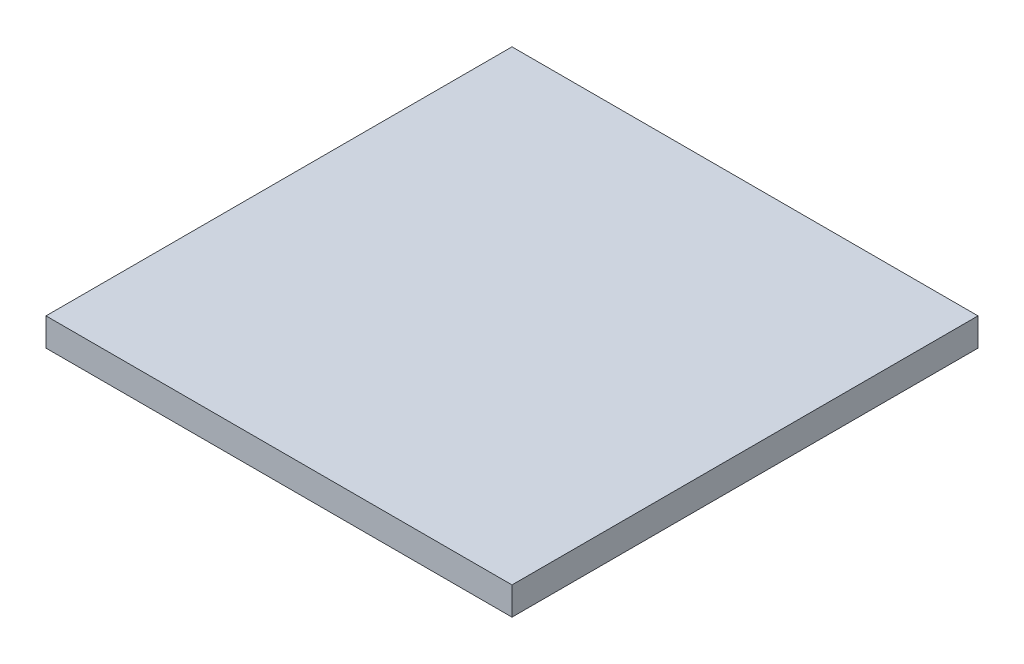
ISO-10303-21;
HEADER;
FILE_DESCRIPTION(('STEP AP214'),'2;1');
FILE_NAME('part.step','',(''),(''),'','','');
FILE_SCHEMA(('AUTOMOTIVE_DESIGN { 1 0 10303 214 1 1 1 1 }'));
ENDSEC;
DATA;
#1=APPLICATION_CONTEXT('core data for automotive mechanical design processes');
#2=APPLICATION_PROTOCOL_DEFINITION('international standard','automotive_design',2000,#1);
#3=PRODUCT_CONTEXT('',#1,'mechanical');
#4=PRODUCT('Part','Part','',(#3));
#5=PRODUCT_RELATED_PRODUCT_CATEGORY('part','',(#4));
#6=PRODUCT_DEFINITION_FORMATION('','',#4);
#7=PRODUCT_DEFINITION_CONTEXT('part definition',#1,'design');
#8=PRODUCT_DEFINITION('design','',#6,#7);
#9=PRODUCT_DEFINITION_SHAPE('','',#8);
#10=(LENGTH_UNIT() NAMED_UNIT(*) SI_UNIT(.MILLI.,.METRE.));
#11=(NAMED_UNIT(*) PLANE_ANGLE_UNIT() SI_UNIT($,.RADIAN.));
#12=(NAMED_UNIT(*) SI_UNIT($,.STERADIAN.) SOLID_ANGLE_UNIT());
#13=UNCERTAINTY_MEASURE_WITH_UNIT(LENGTH_MEASURE(1.E-05),#10,'distance_accuracy_value','');
#14=(GEOMETRIC_REPRESENTATION_CONTEXT(3) GLOBAL_UNCERTAINTY_ASSIGNED_CONTEXT((#13)) GLOBAL_UNIT_ASSIGNED_CONTEXT((#10,
#11,#12)) REPRESENTATION_CONTEXT('',''));
#15=CARTESIAN_POINT('',(0.,0.,0.));
#16=DIRECTION('',(0.,0.,1.));
#17=DIRECTION('',(1.,0.,0.));
#18=AXIS2_PLACEMENT_3D('',#15,#16,#17);
#19=CARTESIAN_POINT('',(0.,3.,0.));
#20=DIRECTION('',(-1.,0.,0.));
#21=DIRECTION('',(0.,0.,1.));
#22=AXIS2_PLACEMENT_3D('',#19,#20,#21);
#23=PLANE('',#22);
#24=DIRECTION('',(0.,0.,-1.));
#25=VECTOR('',#24,1.);
#26=CARTESIAN_POINT('',(0.,0.,0.));
#27=LINE('',#26,#25);
#28=CARTESIAN_POINT('',(0.,0.,0.));
#29=VERTEX_POINT('',#28);
#30=CARTESIAN_POINT('',(0.,0.,-50.));
#31=VERTEX_POINT('',#30);
#32=EDGE_CURVE('E107',#29,#31,#27,.T.);
#33=ORIENTED_EDGE('',*,*,#32,.T.);
#34=DIRECTION('',(0.,-1.,0.));
#35=VECTOR('',#34,1.);
#36=CARTESIAN_POINT('',(0.,3.,-50.));
#37=LINE('',#36,#35);
#38=CARTESIAN_POINT('',(0.,3.,-50.));
#39=VERTEX_POINT('',#38);
#40=EDGE_CURVE('E11',#39,#31,#37,.T.);
#41=ORIENTED_EDGE('',*,*,#40,.F.);
#42=DIRECTION('',(0.,0.,-1.));
#43=VECTOR('',#42,1.);
#44=CARTESIAN_POINT('',(0.,3.,0.));
#45=LINE('',#44,#43);
#46=CARTESIAN_POINT('',(0.,3.,0.));
#47=VERTEX_POINT('',#46);
#48=EDGE_CURVE('E91',#47,#39,#45,.T.);
#49=ORIENTED_EDGE('',*,*,#48,.F.);
#50=DIRECTION('',(0.,-1.,0.));
#51=VECTOR('',#50,1.);
#52=CARTESIAN_POINT('',(0.,3.,0.));
#53=LINE('',#52,#51);
#54=EDGE_CURVE('E103',#47,#29,#53,.T.);
#55=ORIENTED_EDGE('',*,*,#54,.T.);
#56=EDGE_LOOP('',(#33,#41,#49,#55));
#57=FACE_BOUND('',#56,.T.);
#58=ADVANCED_FACE('F39',(#57),#23,.F.);
#59=CARTESIAN_POINT('',(0.,3.,-50.));
#60=DIRECTION('',(0.,0.,1.));
#61=DIRECTION('',(1.,0.,0.));
#62=AXIS2_PLACEMENT_3D('',#59,#60,#61);
#63=PLANE('',#62);
#64=DIRECTION('',(-1.,0.,0.));
#65=VECTOR('',#64,1.);
#66=CARTESIAN_POINT('',(0.,0.,-50.));
#67=LINE('',#66,#65);
#68=CARTESIAN_POINT('',(-50.,0.,-50.));
#69=VERTEX_POINT('',#68);
#70=EDGE_CURVE('E96',#31,#69,#67,.T.);
#71=ORIENTED_EDGE('',*,*,#70,.T.);
#72=DIRECTION('',(0.,-1.,0.));
#73=VECTOR('',#72,1.);
#74=CARTESIAN_POINT('',(-50.,3.,-50.));
#75=LINE('',#74,#73);
#76=CARTESIAN_POINT('',(-50.,3.,-50.));
#77=VERTEX_POINT('',#76);
#78=EDGE_CURVE('E48',#77,#69,#75,.T.);
#79=ORIENTED_EDGE('',*,*,#78,.F.);
#80=DIRECTION('',(-1.,0.,0.));
#81=VECTOR('',#80,1.);
#82=CARTESIAN_POINT('',(0.,3.,-50.));
#83=LINE('',#82,#81);
#84=EDGE_CURVE('E86',#39,#77,#83,.T.);
#85=ORIENTED_EDGE('',*,*,#84,.F.);
#86=ORIENTED_EDGE('',*,*,#40,.T.);
#87=EDGE_LOOP('',(#71,#79,#85,#86));
#88=FACE_BOUND('',#87,.T.);
#89=ADVANCED_FACE('F95',(#88),#63,.F.);
#90=CARTESIAN_POINT('',(-50.,3.,0.));
#91=DIRECTION('',(1.,0.,0.));
#92=DIRECTION('',(0.,0.,-1.));
#93=AXIS2_PLACEMENT_3D('',#90,#91,#92);
#94=PLANE('',#93);
#95=DIRECTION('',(0.,0.,1.));
#96=VECTOR('',#95,1.);
#97=CARTESIAN_POINT('',(-50.,0.,0.));
#98=LINE('',#97,#96);
#99=CARTESIAN_POINT('',(-50.,0.,0.));
#100=VERTEX_POINT('',#99);
#101=EDGE_CURVE('E73',#69,#100,#98,.T.);
#102=ORIENTED_EDGE('',*,*,#101,.T.);
#103=DIRECTION('',(0.,-1.,0.));
#104=VECTOR('',#103,1.);
#105=CARTESIAN_POINT('',(-50.,3.,0.));
#106=LINE('',#105,#104);
#107=CARTESIAN_POINT('',(-50.,3.,0.));
#108=VERTEX_POINT('',#107);
#109=EDGE_CURVE('E98',#108,#100,#106,.T.);
#110=ORIENTED_EDGE('',*,*,#109,.F.);
#111=DIRECTION('',(0.,0.,1.));
#112=VECTOR('',#111,1.);
#113=CARTESIAN_POINT('',(-50.,3.,0.));
#114=LINE('',#113,#112);
#115=EDGE_CURVE('E89',#77,#108,#114,.T.);
#116=ORIENTED_EDGE('',*,*,#115,.F.);
#117=ORIENTED_EDGE('',*,*,#78,.T.);
#118=EDGE_LOOP('',(#102,#110,#116,#117));
#119=FACE_BOUND('',#118,.T.);
#120=ADVANCED_FACE('F99',(#119),#94,.F.);
#121=CARTESIAN_POINT('',(0.,3.,0.));
#122=DIRECTION('',(0.,0.,-1.));
#123=DIRECTION('',(-1.,0.,0.));
#124=AXIS2_PLACEMENT_3D('',#121,#122,#123);
#125=PLANE('',#124);
#126=DIRECTION('',(1.,0.,0.));
#127=VECTOR('',#126,1.);
#128=CARTESIAN_POINT('',(0.,0.,0.));
#129=LINE('',#128,#127);
#130=EDGE_CURVE('E79',#100,#29,#129,.T.);
#131=ORIENTED_EDGE('',*,*,#130,.T.);
#132=ORIENTED_EDGE('',*,*,#54,.F.);
#133=DIRECTION('',(1.,0.,0.));
#134=VECTOR('',#133,1.);
#135=CARTESIAN_POINT('',(0.,3.,0.));
#136=LINE('',#135,#134);
#137=EDGE_CURVE('E56',#108,#47,#136,.T.);
#138=ORIENTED_EDGE('',*,*,#137,.F.);
#139=ORIENTED_EDGE('',*,*,#109,.T.);
#140=EDGE_LOOP('',(#131,#132,#138,#139));
#141=FACE_BOUND('',#140,.T.);
#142=ADVANCED_FACE('F120',(#141),#125,.F.);
#143=CARTESIAN_POINT('',(0.,3.,0.));
#144=DIRECTION('',(0.,1.,0.));
#145=DIRECTION('',(0.,0.,1.));
#146=AXIS2_PLACEMENT_3D('',#143,#144,#145);
#147=PLANE('',#146);
#148=ORIENTED_EDGE('',*,*,#48,.T.);
#149=ORIENTED_EDGE('',*,*,#84,.T.);
#150=ORIENTED_EDGE('',*,*,#115,.T.);
#151=ORIENTED_EDGE('',*,*,#137,.T.);
#152=EDGE_LOOP('',(#148,#149,#150,#151));
#153=FACE_BOUND('',#152,.T.);
#154=ADVANCED_FACE('F87',(#153),#147,.T.);
#155=CARTESIAN_POINT('',(0.,0.,0.));
#156=DIRECTION('',(0.,1.,0.));
#157=DIRECTION('',(0.,0.,1.));
#158=AXIS2_PLACEMENT_3D('',#155,#156,#157);
#159=PLANE('',#158);
#160=ORIENTED_EDGE('',*,*,#32,.F.);
#161=ORIENTED_EDGE('',*,*,#130,.F.);
#162=ORIENTED_EDGE('',*,*,#101,.F.);
#163=ORIENTED_EDGE('',*,*,#70,.F.);
#164=EDGE_LOOP('',(#160,#161,#162,#163));
#165=FACE_BOUND('',#164,.T.);
#166=ADVANCED_FACE('F123',(#165),#159,.F.);
#167=CLOSED_SHELL('',(#58,#89,#120,#142,#154,#166));
#168=MANIFOLD_SOLID_BREP('B2',#167);
#169=ADVANCED_BREP_SHAPE_REPRESENTATION('',(#18,#168),#14);
#170=SHAPE_DEFINITION_REPRESENTATION(#9,#169);
ENDSEC;
END-ISO-10303-21;
